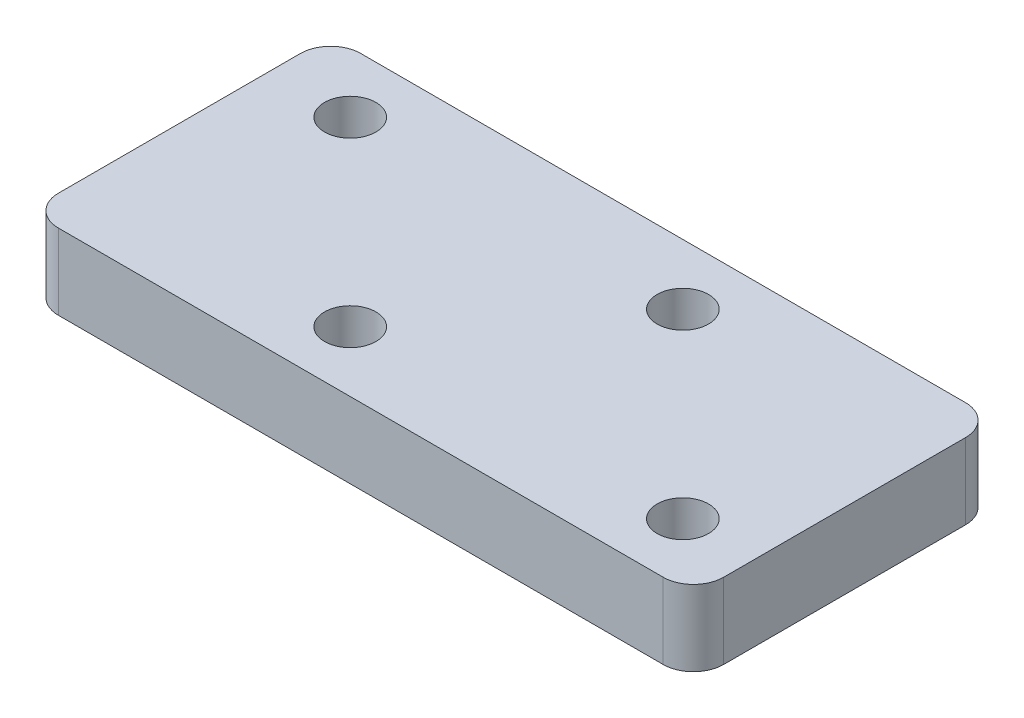
ISO-10303-21;
HEADER;
FILE_DESCRIPTION(('STEP AP214'),'2;1');
FILE_NAME('part.step','',(''),(''),'','','');
FILE_SCHEMA(('AUTOMOTIVE_DESIGN { 1 0 10303 214 1 1 1 1 }'));
ENDSEC;
DATA;
#1=APPLICATION_CONTEXT('core data for automotive mechanical design processes');
#2=APPLICATION_PROTOCOL_DEFINITION('international standard','automotive_design',2000,#1);
#3=PRODUCT_CONTEXT('',#1,'mechanical');
#4=PRODUCT('Part','Part','',(#3));
#5=PRODUCT_RELATED_PRODUCT_CATEGORY('part','',(#4));
#6=PRODUCT_DEFINITION_FORMATION('','',#4);
#7=PRODUCT_DEFINITION_CONTEXT('part definition',#1,'design');
#8=PRODUCT_DEFINITION('design','',#6,#7);
#9=PRODUCT_DEFINITION_SHAPE('','',#8);
#10=(LENGTH_UNIT() NAMED_UNIT(*) SI_UNIT(.MILLI.,.METRE.));
#11=(NAMED_UNIT(*) PLANE_ANGLE_UNIT() SI_UNIT($,.RADIAN.));
#12=(NAMED_UNIT(*) SI_UNIT($,.STERADIAN.) SOLID_ANGLE_UNIT());
#13=UNCERTAINTY_MEASURE_WITH_UNIT(LENGTH_MEASURE(1.E-05),#10,'distance_accuracy_value','');
#14=(GEOMETRIC_REPRESENTATION_CONTEXT(3) GLOBAL_UNCERTAINTY_ASSIGNED_CONTEXT((#13)) GLOBAL_UNIT_ASSIGNED_CONTEXT((#10,
#11,#12)) REPRESENTATION_CONTEXT('',''));
#15=CARTESIAN_POINT('',(0.,0.,0.));
#16=DIRECTION('',(0.,0.,1.));
#17=DIRECTION('',(1.,0.,0.));
#18=AXIS2_PLACEMENT_3D('',#15,#16,#17);
#19=CARTESIAN_POINT('',(0.,5.,0.));
#20=DIRECTION('',(0.,-1.,0.));
#21=DIRECTION('',(0.,0.,-1.));
#22=AXIS2_PLACEMENT_3D('',#19,#20,#21);
#23=PLANE('',#22);
#24=DIRECTION('',(0.,0.,-1.));
#25=VECTOR('',#24,1.);
#26=CARTESIAN_POINT('',(44.,5.,0.));
#27=LINE('',#26,#25);
#28=CARTESIAN_POINT('',(44.,5.,-2.));
#29=VERTEX_POINT('',#28);
#30=CARTESIAN_POINT('',(44.,5.,-18.));
#31=VERTEX_POINT('',#30);
#32=EDGE_CURVE('E206',#29,#31,#27,.T.);
#33=ORIENTED_EDGE('',*,*,#32,.T.);
#34=CARTESIAN_POINT('',(42.,5.,-18.));
#35=DIRECTION('',(0.,-1.,0.));
#36=DIRECTION('',(0.,0.,-1.));
#37=AXIS2_PLACEMENT_3D('',#34,#35,#36);
#38=CIRCLE('',#37,2.);
#39=CARTESIAN_POINT('',(42.,5.,-20.));
#40=VERTEX_POINT('',#39);
#41=EDGE_CURVE('E172',#31,#40,#38,.F.);
#42=ORIENTED_EDGE('',*,*,#41,.T.);
#43=DIRECTION('',(-1.,0.,0.));
#44=VECTOR('',#43,1.);
#45=CARTESIAN_POINT('',(0.,5.,-20.));
#46=LINE('',#45,#44);
#47=CARTESIAN_POINT('',(2.,5.,-20.));
#48=VERTEX_POINT('',#47);
#49=EDGE_CURVE('E131',#40,#48,#46,.T.);
#50=ORIENTED_EDGE('',*,*,#49,.T.);
#51=CARTESIAN_POINT('',(2.,5.,-18.));
#52=DIRECTION('',(0.,-1.,0.));
#53=DIRECTION('',(0.,0.,-1.));
#54=AXIS2_PLACEMENT_3D('',#51,#52,#53);
#55=CIRCLE('',#54,2.);
#56=CARTESIAN_POINT('',(0.,5.,-18.));
#57=VERTEX_POINT('',#56);
#58=EDGE_CURVE('E170',#48,#57,#55,.F.);
#59=ORIENTED_EDGE('',*,*,#58,.T.);
#60=DIRECTION('',(0.,0.,1.));
#61=VECTOR('',#60,1.);
#62=CARTESIAN_POINT('',(0.,5.,0.));
#63=LINE('',#62,#61);
#64=CARTESIAN_POINT('',(0.,5.,-2.));
#65=VERTEX_POINT('',#64);
#66=EDGE_CURVE('E142',#57,#65,#63,.T.);
#67=ORIENTED_EDGE('',*,*,#66,.T.);
#68=CARTESIAN_POINT('',(2.,5.,-2.));
#69=DIRECTION('',(0.,-1.,0.));
#70=DIRECTION('',(0.,0.,-1.));
#71=AXIS2_PLACEMENT_3D('',#68,#69,#70);
#72=CIRCLE('',#71,2.);
#73=CARTESIAN_POINT('',(2.,5.,0.));
#74=VERTEX_POINT('',#73);
#75=EDGE_CURVE('E66',#65,#74,#72,.F.);
#76=ORIENTED_EDGE('',*,*,#75,.T.);
#77=DIRECTION('',(1.,0.,0.));
#78=VECTOR('',#77,1.);
#79=CARTESIAN_POINT('',(0.,5.,0.));
#80=LINE('',#79,#78);
#81=CARTESIAN_POINT('',(42.,5.,0.));
#82=VERTEX_POINT('',#81);
#83=EDGE_CURVE('E150',#74,#82,#80,.T.);
#84=ORIENTED_EDGE('',*,*,#83,.T.);
#85=CARTESIAN_POINT('',(42.,5.,-2.));
#86=DIRECTION('',(0.,-1.,0.));
#87=DIRECTION('',(0.,0.,-1.));
#88=AXIS2_PLACEMENT_3D('',#85,#86,#87);
#89=CIRCLE('',#88,2.);
#90=EDGE_CURVE('E175',#82,#29,#89,.F.);
#91=ORIENTED_EDGE('',*,*,#90,.T.);
#92=EDGE_LOOP('',(#33,#42,#50,#59,#67,#76,#84,#91));
#93=FACE_BOUND('',#92,.T.);
#94=CARTESIAN_POINT('',(5.3,5.,-16.));
#95=DIRECTION('',(0.,1.,0.));
#96=DIRECTION('',(0.,0.,1.));
#97=AXIS2_PLACEMENT_3D('',#94,#95,#96);
#98=CIRCLE('',#97,1.7);
#99=CARTESIAN_POINT('',(5.3,5.,-14.3));
#100=VERTEX_POINT('',#99);
#101=EDGE_CURVE('E198',#100,#100,#98,.T.);
#102=ORIENTED_EDGE('',*,*,#101,.F.);
#103=EDGE_LOOP('',(#102));
#104=FACE_BOUND('',#103,.T.);
#105=CARTESIAN_POINT('',(17.3,5.,-4.));
#106=DIRECTION('',(0.,1.,0.));
#107=DIRECTION('',(0.,0.,1.));
#108=AXIS2_PLACEMENT_3D('',#105,#106,#107);
#109=CIRCLE('',#108,1.7);
#110=CARTESIAN_POINT('',(17.3,5.,-2.3));
#111=VERTEX_POINT('',#110);
#112=EDGE_CURVE('E212',#111,#111,#109,.T.);
#113=ORIENTED_EDGE('',*,*,#112,.F.);
#114=EDGE_LOOP('',(#113));
#115=FACE_BOUND('',#114,.T.);
#116=CARTESIAN_POINT('',(27.3,5.,-16.));
#117=DIRECTION('',(0.,1.,0.));
#118=DIRECTION('',(0.,0.,1.));
#119=AXIS2_PLACEMENT_3D('',#116,#117,#118);
#120=CIRCLE('',#119,1.7);
#121=CARTESIAN_POINT('',(27.3,5.,-14.3));
#122=VERTEX_POINT('',#121);
#123=EDGE_CURVE('E219',#122,#122,#120,.T.);
#124=ORIENTED_EDGE('',*,*,#123,.F.);
#125=EDGE_LOOP('',(#124));
#126=FACE_BOUND('',#125,.T.);
#127=CARTESIAN_POINT('',(39.3,5.,-4.));
#128=DIRECTION('',(0.,1.,0.));
#129=DIRECTION('',(0.,0.,1.));
#130=AXIS2_PLACEMENT_3D('',#127,#128,#129);
#131=CIRCLE('',#130,1.7);
#132=CARTESIAN_POINT('',(39.3,5.,-2.3));
#133=VERTEX_POINT('',#132);
#134=EDGE_CURVE('E226',#133,#133,#131,.T.);
#135=ORIENTED_EDGE('',*,*,#134,.F.);
#136=EDGE_LOOP('',(#135));
#137=FACE_BOUND('',#136,.T.);
#138=ADVANCED_FACE('F44',(#93,#104,#115,#126,#137),#23,.F.);
#139=CARTESIAN_POINT('',(0.,0.,0.));
#140=DIRECTION('',(0.,-1.,0.));
#141=DIRECTION('',(0.,0.,-1.));
#142=AXIS2_PLACEMENT_3D('',#139,#140,#141);
#143=PLANE('',#142);
#144=CARTESIAN_POINT('',(27.3,0.,-16.));
#145=DIRECTION('',(0.,1.,0.));
#146=DIRECTION('',(0.,0.,1.));
#147=AXIS2_PLACEMENT_3D('',#144,#145,#146);
#148=CIRCLE('',#147,1.7);
#149=CARTESIAN_POINT('',(27.3,0.,-14.3));
#150=VERTEX_POINT('',#149);
#151=EDGE_CURVE('E221',#150,#150,#148,.T.);
#152=ORIENTED_EDGE('',*,*,#151,.T.);
#153=EDGE_LOOP('',(#152));
#154=FACE_BOUND('',#153,.T.);
#155=CARTESIAN_POINT('',(5.3,0.,-16.));
#156=DIRECTION('',(0.,1.,0.));
#157=DIRECTION('',(0.,0.,1.));
#158=AXIS2_PLACEMENT_3D('',#155,#156,#157);
#159=CIRCLE('',#158,1.7);
#160=CARTESIAN_POINT('',(5.3,0.,-14.3));
#161=VERTEX_POINT('',#160);
#162=EDGE_CURVE('E203',#161,#161,#159,.T.);
#163=ORIENTED_EDGE('',*,*,#162,.T.);
#164=EDGE_LOOP('',(#163));
#165=FACE_BOUND('',#164,.T.);
#166=DIRECTION('',(-1.,0.,0.));
#167=VECTOR('',#166,1.);
#168=CARTESIAN_POINT('',(0.,0.,-20.));
#169=LINE('',#168,#167);
#170=CARTESIAN_POINT('',(42.,0.,-20.));
#171=VERTEX_POINT('',#170);
#172=CARTESIAN_POINT('',(2.,0.,-20.));
#173=VERTEX_POINT('',#172);
#174=EDGE_CURVE('E128',#171,#173,#169,.T.);
#175=ORIENTED_EDGE('',*,*,#174,.F.);
#176=CARTESIAN_POINT('',(42.,0.,-18.));
#177=DIRECTION('',(0.,-1.,0.));
#178=DIRECTION('',(0.,0.,-1.));
#179=AXIS2_PLACEMENT_3D('',#176,#177,#178);
#180=CIRCLE('',#179,2.);
#181=CARTESIAN_POINT('',(44.,0.,-18.));
#182=VERTEX_POINT('',#181);
#183=EDGE_CURVE('E115',#171,#182,#180,.T.);
#184=ORIENTED_EDGE('',*,*,#183,.T.);
#185=DIRECTION('',(0.,0.,-1.));
#186=VECTOR('',#185,1.);
#187=CARTESIAN_POINT('',(44.,0.,0.));
#188=LINE('',#187,#186);
#189=CARTESIAN_POINT('',(44.,0.,-2.));
#190=VERTEX_POINT('',#189);
#191=EDGE_CURVE('E141',#190,#182,#188,.T.);
#192=ORIENTED_EDGE('',*,*,#191,.F.);
#193=CARTESIAN_POINT('',(42.,0.,-2.));
#194=DIRECTION('',(0.,-1.,0.));
#195=DIRECTION('',(0.,0.,-1.));
#196=AXIS2_PLACEMENT_3D('',#193,#194,#195);
#197=CIRCLE('',#196,2.);
#198=CARTESIAN_POINT('',(42.,0.,0.));
#199=VERTEX_POINT('',#198);
#200=EDGE_CURVE('E122',#190,#199,#197,.T.);
#201=ORIENTED_EDGE('',*,*,#200,.T.);
#202=DIRECTION('',(1.,0.,0.));
#203=VECTOR('',#202,1.);
#204=CARTESIAN_POINT('',(0.,0.,0.));
#205=LINE('',#204,#203);
#206=CARTESIAN_POINT('',(2.,0.,0.));
#207=VERTEX_POINT('',#206);
#208=EDGE_CURVE('E149',#207,#199,#205,.T.);
#209=ORIENTED_EDGE('',*,*,#208,.F.);
#210=CARTESIAN_POINT('',(2.,0.,-2.));
#211=DIRECTION('',(0.,-1.,0.));
#212=DIRECTION('',(0.,0.,-1.));
#213=AXIS2_PLACEMENT_3D('',#210,#211,#212);
#214=CIRCLE('',#213,2.);
#215=CARTESIAN_POINT('',(0.,0.,-2.));
#216=VERTEX_POINT('',#215);
#217=EDGE_CURVE('E160',#207,#216,#214,.T.);
#218=ORIENTED_EDGE('',*,*,#217,.T.);
#219=DIRECTION('',(0.,0.,1.));
#220=VECTOR('',#219,1.);
#221=CARTESIAN_POINT('',(0.,0.,0.));
#222=LINE('',#221,#220);
#223=CARTESIAN_POINT('',(0.,0.,-18.));
#224=VERTEX_POINT('',#223);
#225=EDGE_CURVE('E187',#224,#216,#222,.T.);
#226=ORIENTED_EDGE('',*,*,#225,.F.);
#227=CARTESIAN_POINT('',(2.,0.,-18.));
#228=DIRECTION('',(0.,-1.,0.));
#229=DIRECTION('',(0.,0.,-1.));
#230=AXIS2_PLACEMENT_3D('',#227,#228,#229);
#231=CIRCLE('',#230,2.);
#232=EDGE_CURVE('E132',#224,#173,#231,.T.);
#233=ORIENTED_EDGE('',*,*,#232,.T.);
#234=EDGE_LOOP('',(#175,#184,#192,#201,#209,#218,#226,#233));
#235=FACE_BOUND('',#234,.T.);
#236=CARTESIAN_POINT('',(17.3,0.,-4.));
#237=DIRECTION('',(0.,1.,0.));
#238=DIRECTION('',(0.,0.,1.));
#239=AXIS2_PLACEMENT_3D('',#236,#237,#238);
#240=CIRCLE('',#239,1.7);
#241=CARTESIAN_POINT('',(17.3,0.,-2.3));
#242=VERTEX_POINT('',#241);
#243=EDGE_CURVE('E216',#242,#242,#240,.T.);
#244=ORIENTED_EDGE('',*,*,#243,.T.);
#245=EDGE_LOOP('',(#244));
#246=FACE_BOUND('',#245,.T.);
#247=CARTESIAN_POINT('',(39.3,0.,-4.));
#248=DIRECTION('',(0.,1.,0.));
#249=DIRECTION('',(0.,0.,1.));
#250=AXIS2_PLACEMENT_3D('',#247,#248,#249);
#251=CIRCLE('',#250,1.7);
#252=CARTESIAN_POINT('',(39.3,0.,-2.3));
#253=VERTEX_POINT('',#252);
#254=EDGE_CURVE('E235',#253,#253,#251,.T.);
#255=ORIENTED_EDGE('',*,*,#254,.T.);
#256=EDGE_LOOP('',(#255));
#257=FACE_BOUND('',#256,.T.);
#258=ADVANCED_FACE('F136',(#154,#165,#235,#246,#257),#143,.T.);
#259=CARTESIAN_POINT('',(0.,5.,0.));
#260=DIRECTION('',(1.,0.,0.));
#261=DIRECTION('',(0.,0.,-1.));
#262=AXIS2_PLACEMENT_3D('',#259,#260,#261);
#263=PLANE('',#262);
#264=ORIENTED_EDGE('',*,*,#225,.T.);
#265=DIRECTION('',(0.,-1.,0.));
#266=VECTOR('',#265,1.);
#267=CARTESIAN_POINT('',(0.,5.,-2.));
#268=LINE('',#267,#266);
#269=EDGE_CURVE('E11',#216,#65,#268,.F.);
#270=ORIENTED_EDGE('',*,*,#269,.T.);
#271=ORIENTED_EDGE('',*,*,#66,.F.);
#272=DIRECTION('',(0.,-1.,0.));
#273=VECTOR('',#272,1.);
#274=CARTESIAN_POINT('',(0.,5.,-18.));
#275=LINE('',#274,#273);
#276=EDGE_CURVE('E53',#57,#224,#275,.T.);
#277=ORIENTED_EDGE('',*,*,#276,.T.);
#278=EDGE_LOOP('',(#264,#270,#271,#277));
#279=FACE_BOUND('',#278,.T.);
#280=ADVANCED_FACE('F189',(#279),#263,.F.);
#281=CARTESIAN_POINT('',(0.,5.,0.));
#282=DIRECTION('',(0.,0.,-1.));
#283=DIRECTION('',(-1.,0.,0.));
#284=AXIS2_PLACEMENT_3D('',#281,#282,#283);
#285=PLANE('',#284);
#286=ORIENTED_EDGE('',*,*,#208,.T.);
#287=DIRECTION('',(0.,-1.,0.));
#288=VECTOR('',#287,1.);
#289=CARTESIAN_POINT('',(42.,5.,0.));
#290=LINE('',#289,#288);
#291=EDGE_CURVE('E63',#199,#82,#290,.F.);
#292=ORIENTED_EDGE('',*,*,#291,.T.);
#293=ORIENTED_EDGE('',*,*,#83,.F.);
#294=DIRECTION('',(0.,-1.,0.));
#295=VECTOR('',#294,1.);
#296=CARTESIAN_POINT('',(2.,5.,0.));
#297=LINE('',#296,#295);
#298=EDGE_CURVE('E176',#74,#207,#297,.T.);
#299=ORIENTED_EDGE('',*,*,#298,.T.);
#300=EDGE_LOOP('',(#286,#292,#293,#299));
#301=FACE_BOUND('',#300,.T.);
#302=ADVANCED_FACE('F261',(#301),#285,.F.);
#303=CARTESIAN_POINT('',(44.,5.,0.));
#304=DIRECTION('',(-1.,0.,0.));
#305=DIRECTION('',(0.,0.,1.));
#306=AXIS2_PLACEMENT_3D('',#303,#304,#305);
#307=PLANE('',#306);
#308=ORIENTED_EDGE('',*,*,#191,.T.);
#309=DIRECTION('',(0.,-1.,0.));
#310=VECTOR('',#309,1.);
#311=CARTESIAN_POINT('',(44.,5.,-18.));
#312=LINE('',#311,#310);
#313=EDGE_CURVE('E120',#182,#31,#312,.F.);
#314=ORIENTED_EDGE('',*,*,#313,.T.);
#315=ORIENTED_EDGE('',*,*,#32,.F.);
#316=DIRECTION('',(0.,-1.,0.));
#317=VECTOR('',#316,1.);
#318=CARTESIAN_POINT('',(44.,5.,-2.));
#319=LINE('',#318,#317);
#320=EDGE_CURVE('E121',#29,#190,#319,.T.);
#321=ORIENTED_EDGE('',*,*,#320,.T.);
#322=EDGE_LOOP('',(#308,#314,#315,#321));
#323=FACE_BOUND('',#322,.T.);
#324=ADVANCED_FACE('F256',(#323),#307,.F.);
#325=CARTESIAN_POINT('',(0.,5.,-20.));
#326=DIRECTION('',(0.,0.,1.));
#327=DIRECTION('',(1.,0.,0.));
#328=AXIS2_PLACEMENT_3D('',#325,#326,#327);
#329=PLANE('',#328);
#330=ORIENTED_EDGE('',*,*,#49,.F.);
#331=DIRECTION('',(0.,-1.,0.));
#332=VECTOR('',#331,1.);
#333=CARTESIAN_POINT('',(42.,5.,-20.));
#334=LINE('',#333,#332);
#335=EDGE_CURVE('E118',#40,#171,#334,.T.);
#336=ORIENTED_EDGE('',*,*,#335,.T.);
#337=ORIENTED_EDGE('',*,*,#174,.T.);
#338=DIRECTION('',(0.,-1.,0.));
#339=VECTOR('',#338,1.);
#340=CARTESIAN_POINT('',(2.,5.,-20.));
#341=LINE('',#340,#339);
#342=EDGE_CURVE('E138',#173,#48,#341,.F.);
#343=ORIENTED_EDGE('',*,*,#342,.T.);
#344=EDGE_LOOP('',(#330,#336,#337,#343));
#345=FACE_BOUND('',#344,.T.);
#346=ADVANCED_FACE('F129',(#345),#329,.F.);
#347=CARTESIAN_POINT('',(5.3,5.,-16.));
#348=DIRECTION('',(0.,-1.,0.));
#349=DIRECTION('',(0.,0.,-1.));
#350=AXIS2_PLACEMENT_3D('',#347,#348,#349);
#351=CYLINDRICAL_SURFACE('',#350,1.7);
#352=ORIENTED_EDGE('',*,*,#101,.T.);
#353=EDGE_LOOP('',(#352));
#354=FACE_BOUND('',#353,.T.);
#355=ORIENTED_EDGE('',*,*,#162,.F.);
#356=EDGE_LOOP('',(#355));
#357=FACE_BOUND('',#356,.T.);
#358=ADVANCED_FACE('F251',(#354,#357),#351,.F.);
#359=CARTESIAN_POINT('',(17.3,5.,-4.));
#360=DIRECTION('',(0.,-1.,0.));
#361=DIRECTION('',(0.,0.,-1.));
#362=AXIS2_PLACEMENT_3D('',#359,#360,#361);
#363=CYLINDRICAL_SURFACE('',#362,1.7);
#364=ORIENTED_EDGE('',*,*,#112,.T.);
#365=EDGE_LOOP('',(#364));
#366=FACE_BOUND('',#365,.T.);
#367=ORIENTED_EDGE('',*,*,#243,.F.);
#368=EDGE_LOOP('',(#367));
#369=FACE_BOUND('',#368,.T.);
#370=ADVANCED_FACE('F318',(#366,#369),#363,.F.);
#371=CARTESIAN_POINT('',(27.3,5.,-16.));
#372=DIRECTION('',(0.,-1.,0.));
#373=DIRECTION('',(0.,0.,-1.));
#374=AXIS2_PLACEMENT_3D('',#371,#372,#373);
#375=CYLINDRICAL_SURFACE('',#374,1.7);
#376=ORIENTED_EDGE('',*,*,#123,.T.);
#377=EDGE_LOOP('',(#376));
#378=FACE_BOUND('',#377,.T.);
#379=ORIENTED_EDGE('',*,*,#151,.F.);
#380=EDGE_LOOP('',(#379));
#381=FACE_BOUND('',#380,.T.);
#382=ADVANCED_FACE('F310',(#378,#381),#375,.F.);
#383=CARTESIAN_POINT('',(39.3,5.,-4.));
#384=DIRECTION('',(0.,-1.,0.));
#385=DIRECTION('',(0.,0.,-1.));
#386=AXIS2_PLACEMENT_3D('',#383,#384,#385);
#387=CYLINDRICAL_SURFACE('',#386,1.7);
#388=ORIENTED_EDGE('',*,*,#134,.T.);
#389=EDGE_LOOP('',(#388));
#390=FACE_BOUND('',#389,.T.);
#391=ORIENTED_EDGE('',*,*,#254,.F.);
#392=EDGE_LOOP('',(#391));
#393=FACE_BOUND('',#392,.T.);
#394=ADVANCED_FACE('F238',(#390,#393),#387,.F.);
#395=CARTESIAN_POINT('',(42.,5.,-18.));
#396=DIRECTION('',(0.,-1.,0.));
#397=DIRECTION('',(0.,0.,-1.));
#398=AXIS2_PLACEMENT_3D('',#395,#396,#397);
#399=CYLINDRICAL_SURFACE('',#398,2.);
#400=ORIENTED_EDGE('',*,*,#41,.F.);
#401=ORIENTED_EDGE('',*,*,#313,.F.);
#402=ORIENTED_EDGE('',*,*,#183,.F.);
#403=ORIENTED_EDGE('',*,*,#335,.F.);
#404=EDGE_LOOP('',(#400,#401,#402,#403));
#405=FACE_BOUND('',#404,.T.);
#406=ADVANCED_FACE('F113',(#405),#399,.T.);
#407=CARTESIAN_POINT('',(42.,5.,-2.));
#408=DIRECTION('',(0.,-1.,0.));
#409=DIRECTION('',(0.,0.,-1.));
#410=AXIS2_PLACEMENT_3D('',#407,#408,#409);
#411=CYLINDRICAL_SURFACE('',#410,2.);
#412=ORIENTED_EDGE('',*,*,#90,.F.);
#413=ORIENTED_EDGE('',*,*,#291,.F.);
#414=ORIENTED_EDGE('',*,*,#200,.F.);
#415=ORIENTED_EDGE('',*,*,#320,.F.);
#416=EDGE_LOOP('',(#412,#413,#414,#415));
#417=FACE_BOUND('',#416,.T.);
#418=ADVANCED_FACE('F267',(#417),#411,.T.);
#419=CARTESIAN_POINT('',(2.,5.,-2.));
#420=DIRECTION('',(0.,-1.,0.));
#421=DIRECTION('',(0.,0.,-1.));
#422=AXIS2_PLACEMENT_3D('',#419,#420,#421);
#423=CYLINDRICAL_SURFACE('',#422,2.);
#424=ORIENTED_EDGE('',*,*,#75,.F.);
#425=ORIENTED_EDGE('',*,*,#269,.F.);
#426=ORIENTED_EDGE('',*,*,#217,.F.);
#427=ORIENTED_EDGE('',*,*,#298,.F.);
#428=EDGE_LOOP('',(#424,#425,#426,#427));
#429=FACE_BOUND('',#428,.T.);
#430=ADVANCED_FACE('F271',(#429),#423,.T.);
#431=CARTESIAN_POINT('',(2.,5.,-18.));
#432=DIRECTION('',(0.,-1.,0.));
#433=DIRECTION('',(0.,0.,-1.));
#434=AXIS2_PLACEMENT_3D('',#431,#432,#433);
#435=CYLINDRICAL_SURFACE('',#434,2.);
#436=ORIENTED_EDGE('',*,*,#58,.F.);
#437=ORIENTED_EDGE('',*,*,#342,.F.);
#438=ORIENTED_EDGE('',*,*,#232,.F.);
#439=ORIENTED_EDGE('',*,*,#276,.F.);
#440=EDGE_LOOP('',(#436,#437,#438,#439));
#441=FACE_BOUND('',#440,.T.);
#442=ADVANCED_FACE('F50',(#441),#435,.T.);
#443=CLOSED_SHELL('',(#138,#258,#280,#302,#324,#346,#358,#370,#382,#394,#406,#418,#430,#442));
#444=MANIFOLD_SOLID_BREP('B2',#443);
#445=ADVANCED_BREP_SHAPE_REPRESENTATION('',(#18,#444),#14);
#446=SHAPE_DEFINITION_REPRESENTATION(#9,#445);
ENDSEC;
END-ISO-10303-21;
